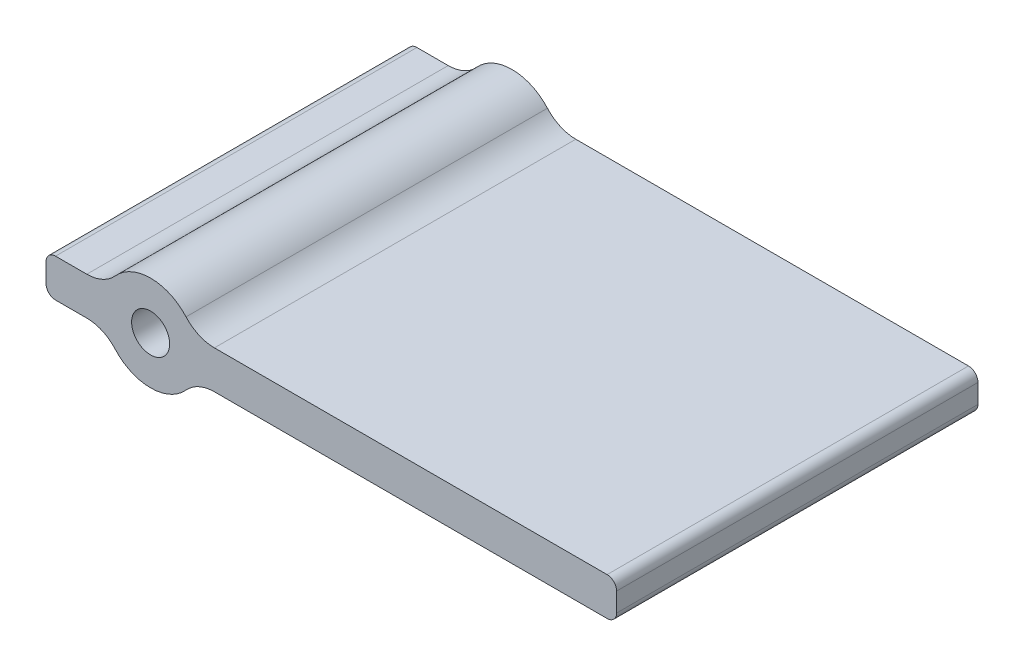
ISO-10303-21;
HEADER;
FILE_DESCRIPTION(('STEP AP214'),'2;1');
FILE_NAME('part.step','',(''),(''),'','','');
FILE_SCHEMA(('AUTOMOTIVE_DESIGN { 1 0 10303 214 1 1 1 1 }'));
ENDSEC;
DATA;
#1=APPLICATION_CONTEXT('core data for automotive mechanical design processes');
#2=APPLICATION_PROTOCOL_DEFINITION('international standard','automotive_design',2000,#1);
#3=PRODUCT_CONTEXT('',#1,'mechanical');
#4=PRODUCT('Part','Part','',(#3));
#5=PRODUCT_RELATED_PRODUCT_CATEGORY('part','',(#4));
#6=PRODUCT_DEFINITION_FORMATION('','',#4);
#7=PRODUCT_DEFINITION_CONTEXT('part definition',#1,'design');
#8=PRODUCT_DEFINITION('design','',#6,#7);
#9=PRODUCT_DEFINITION_SHAPE('','',#8);
#10=(LENGTH_UNIT() NAMED_UNIT(*) SI_UNIT(.MILLI.,.METRE.));
#11=(NAMED_UNIT(*) PLANE_ANGLE_UNIT() SI_UNIT($,.RADIAN.));
#12=(NAMED_UNIT(*) SI_UNIT($,.STERADIAN.) SOLID_ANGLE_UNIT());
#13=UNCERTAINTY_MEASURE_WITH_UNIT(LENGTH_MEASURE(1.E-05),#10,'distance_accuracy_value','');
#14=(GEOMETRIC_REPRESENTATION_CONTEXT(3) GLOBAL_UNCERTAINTY_ASSIGNED_CONTEXT((#13)) GLOBAL_UNIT_ASSIGNED_CONTEXT((#10,
#11,#12)) REPRESENTATION_CONTEXT('',''));
#15=CARTESIAN_POINT('',(0.,0.,0.));
#16=DIRECTION('',(0.,0.,1.));
#17=DIRECTION('',(1.,0.,0.));
#18=AXIS2_PLACEMENT_3D('',#15,#16,#17);
#19=CARTESIAN_POINT('',(-948.662974387242,303.887338025483,-9.5));
#20=DIRECTION('',(0.,0.,1.));
#21=DIRECTION('',(1.,0.,0.));
#22=AXIS2_PLACEMENT_3D('',#19,#20,#21);
#23=CYLINDRICAL_SURFACE('',#22,0.499999999999973);
#24=DIRECTION('',(0.,0.,1.));
#25=VECTOR('',#24,1.);
#26=CARTESIAN_POINT('',(-948.662974387242,303.387338025483,-9.5));
#27=LINE('',#26,#25);
#28=CARTESIAN_POINT('',(-948.662974387242,303.387338025483,-9.5));
#29=VERTEX_POINT('',#28);
#30=CARTESIAN_POINT('',(-948.662974387242,303.387338025483,9.5));
#31=VERTEX_POINT('',#30);
#32=EDGE_CURVE('E46',#29,#31,#27,.T.);
#33=ORIENTED_EDGE('',*,*,#32,.T.);
#34=CARTESIAN_POINT('',(-948.662974387242,303.887338025483,9.5));
#35=DIRECTION('',(0.,0.,1.));
#36=DIRECTION('',(-1.,0.,0.));
#37=AXIS2_PLACEMENT_3D('',#34,#35,#36);
#38=CIRCLE('',#37,0.499999999999973);
#39=CARTESIAN_POINT('',(-949.162974387242,303.887338025483,9.5));
#40=VERTEX_POINT('',#39);
#41=EDGE_CURVE('E155',#40,#31,#38,.T.);
#42=ORIENTED_EDGE('',*,*,#41,.F.);
#43=DIRECTION('',(0.,0.,1.));
#44=VECTOR('',#43,1.);
#45=CARTESIAN_POINT('',(-949.162974387242,303.887338025483,-9.5));
#46=LINE('',#45,#44);
#47=CARTESIAN_POINT('',(-949.162974387242,303.887338025483,-9.5));
#48=VERTEX_POINT('',#47);
#49=EDGE_CURVE('E13',#48,#40,#46,.T.);
#50=ORIENTED_EDGE('',*,*,#49,.F.);
#51=CARTESIAN_POINT('',(-948.662974387242,303.887338025483,-9.5));
#52=DIRECTION('',(0.,0.,1.));
#53=DIRECTION('',(-1.,0.,0.));
#54=AXIS2_PLACEMENT_3D('',#51,#52,#53);
#55=CIRCLE('',#54,0.499999999999973);
#56=EDGE_CURVE('E156',#48,#29,#55,.T.);
#57=ORIENTED_EDGE('',*,*,#56,.T.);
#58=EDGE_LOOP('',(#33,#42,#50,#57));
#59=FACE_BOUND('',#58,.T.);
#60=ADVANCED_FACE('F43',(#59),#23,.T.);
#61=CARTESIAN_POINT('',(-949.162974387242,303.887338025483,-9.5));
#62=DIRECTION('',(-1.,0.,0.));
#63=DIRECTION('',(0.,0.,1.));
#64=AXIS2_PLACEMENT_3D('',#61,#62,#63);
#65=PLANE('',#64);
#66=ORIENTED_EDGE('',*,*,#49,.T.);
#67=DIRECTION('',(0.,-1.,0.));
#68=VECTOR('',#67,1.);
#69=CARTESIAN_POINT('',(-949.162974387242,303.887338025483,9.5));
#70=LINE('',#69,#68);
#71=CARTESIAN_POINT('',(-949.162974387242,304.887338025483,9.5));
#72=VERTEX_POINT('',#71);
#73=EDGE_CURVE('E174',#72,#40,#70,.T.);
#74=ORIENTED_EDGE('',*,*,#73,.F.);
#75=DIRECTION('',(0.,0.,1.));
#76=VECTOR('',#75,1.);
#77=CARTESIAN_POINT('',(-949.162974387242,304.887338025483,-9.5));
#78=LINE('',#77,#76);
#79=CARTESIAN_POINT('',(-949.162974387242,304.887338025483,-9.5));
#80=VERTEX_POINT('',#79);
#81=EDGE_CURVE('E51',#80,#72,#78,.T.);
#82=ORIENTED_EDGE('',*,*,#81,.F.);
#83=DIRECTION('',(0.,-1.,0.));
#84=VECTOR('',#83,1.);
#85=CARTESIAN_POINT('',(-949.162974387242,303.887338025483,-9.5));
#86=LINE('',#85,#84);
#87=EDGE_CURVE('E161',#80,#48,#86,.T.);
#88=ORIENTED_EDGE('',*,*,#87,.T.);
#89=EDGE_LOOP('',(#66,#74,#82,#88));
#90=FACE_BOUND('',#89,.T.);
#91=ADVANCED_FACE('F340',(#90),#65,.T.);
#92=CARTESIAN_POINT('',(-948.662974387242,304.887338025483,-9.5));
#93=DIRECTION('',(0.,0.,1.));
#94=DIRECTION('',(1.,0.,0.));
#95=AXIS2_PLACEMENT_3D('',#92,#93,#94);
#96=CYLINDRICAL_SURFACE('',#95,0.499999999999973);
#97=ORIENTED_EDGE('',*,*,#81,.T.);
#98=CARTESIAN_POINT('',(-948.662974387242,304.887338025483,9.5));
#99=DIRECTION('',(0.,0.,1.));
#100=DIRECTION('',(-1.,0.,0.));
#101=AXIS2_PLACEMENT_3D('',#98,#99,#100);
#102=CIRCLE('',#101,0.499999999999973);
#103=CARTESIAN_POINT('',(-948.662974387242,305.387338025483,9.5));
#104=VERTEX_POINT('',#103);
#105=EDGE_CURVE('E214',#104,#72,#102,.T.);
#106=ORIENTED_EDGE('',*,*,#105,.F.);
#107=DIRECTION('',(0.,0.,1.));
#108=VECTOR('',#107,1.);
#109=CARTESIAN_POINT('',(-948.662974387242,305.387338025483,-9.5));
#110=LINE('',#109,#108);
#111=CARTESIAN_POINT('',(-948.662974387242,305.387338025483,-9.5));
#112=VERTEX_POINT('',#111);
#113=EDGE_CURVE('E263',#112,#104,#110,.T.);
#114=ORIENTED_EDGE('',*,*,#113,.F.);
#115=CARTESIAN_POINT('',(-948.662974387242,304.887338025483,-9.5));
#116=DIRECTION('',(0.,0.,1.));
#117=DIRECTION('',(-1.,0.,0.));
#118=AXIS2_PLACEMENT_3D('',#115,#116,#117);
#119=CIRCLE('',#118,0.499999999999973);
#120=EDGE_CURVE('E259',#112,#80,#119,.T.);
#121=ORIENTED_EDGE('',*,*,#120,.T.);
#122=EDGE_LOOP('',(#97,#106,#114,#121));
#123=FACE_BOUND('',#122,.T.);
#124=ADVANCED_FACE('F338',(#123),#96,.T.);
#125=CARTESIAN_POINT('',(-948.662974387242,305.387338025483,-9.5));
#126=DIRECTION('',(0.,1.,0.));
#127=DIRECTION('',(0.,0.,1.));
#128=AXIS2_PLACEMENT_3D('',#125,#126,#127);
#129=PLANE('',#128);
#130=ORIENTED_EDGE('',*,*,#113,.T.);
#131=DIRECTION('',(-1.,0.,0.));
#132=VECTOR('',#131,1.);
#133=CARTESIAN_POINT('',(-948.662974387242,305.387338025483,9.5));
#134=LINE('',#133,#132);
#135=CARTESIAN_POINT('',(-947.017076353491,305.387338025483,9.5));
#136=VERTEX_POINT('',#135);
#137=EDGE_CURVE('E211',#136,#104,#134,.T.);
#138=ORIENTED_EDGE('',*,*,#137,.F.);
#139=DIRECTION('',(0.,0.,1.));
#140=VECTOR('',#139,1.);
#141=CARTESIAN_POINT('',(-947.017076353491,305.387338025483,-9.5));
#142=LINE('',#141,#140);
#143=CARTESIAN_POINT('',(-947.017076353491,305.387338025483,-9.5));
#144=VERTEX_POINT('',#143);
#145=EDGE_CURVE('E265',#144,#136,#142,.T.);
#146=ORIENTED_EDGE('',*,*,#145,.F.);
#147=DIRECTION('',(-1.,0.,0.));
#148=VECTOR('',#147,1.);
#149=CARTESIAN_POINT('',(-948.662974387242,305.387338025483,-9.5));
#150=LINE('',#149,#148);
#151=EDGE_CURVE('E256',#144,#112,#150,.T.);
#152=ORIENTED_EDGE('',*,*,#151,.T.);
#153=EDGE_LOOP('',(#130,#138,#146,#152));
#154=FACE_BOUND('',#153,.T.);
#155=ADVANCED_FACE('F334',(#154),#129,.T.);
#156=CARTESIAN_POINT('',(-947.017076353491,307.387338025483,-9.5));
#157=DIRECTION('',(0.,0.,1.));
#158=DIRECTION('',(1.,0.,0.));
#159=AXIS2_PLACEMENT_3D('',#156,#157,#158);
#160=CYLINDRICAL_SURFACE('',#159,2.);
#161=ORIENTED_EDGE('',*,*,#145,.T.);
#162=CARTESIAN_POINT('',(-947.017076353491,307.387338025483,9.5));
#163=DIRECTION('',(0.,0.,-1.));
#164=DIRECTION('',(1.,0.,0.));
#165=AXIS2_PLACEMENT_3D('',#162,#163,#164);
#166=CIRCLE('',#165,2.);
#167=CARTESIAN_POINT('',(-945.526364368492,306.054004692149,9.5));
#168=VERTEX_POINT('',#167);
#169=EDGE_CURVE('E208',#168,#136,#166,.T.);
#170=ORIENTED_EDGE('',*,*,#169,.F.);
#171=DIRECTION('',(0.,0.,1.));
#172=VECTOR('',#171,1.);
#173=CARTESIAN_POINT('',(-945.526364368492,306.054004692149,-9.5));
#174=LINE('',#173,#172);
#175=CARTESIAN_POINT('',(-945.526364368492,306.054004692149,-9.5));
#176=VERTEX_POINT('',#175);
#177=EDGE_CURVE('E267',#176,#168,#174,.T.);
#178=ORIENTED_EDGE('',*,*,#177,.F.);
#179=CARTESIAN_POINT('',(-947.017076353491,307.387338025483,-9.5));
#180=DIRECTION('',(0.,0.,-1.));
#181=DIRECTION('',(1.,0.,0.));
#182=AXIS2_PLACEMENT_3D('',#179,#180,#181);
#183=CIRCLE('',#182,2.);
#184=EDGE_CURVE('E253',#176,#144,#183,.T.);
#185=ORIENTED_EDGE('',*,*,#184,.T.);
#186=EDGE_LOOP('',(#161,#170,#178,#185));
#187=FACE_BOUND('',#186,.T.);
#188=ADVANCED_FACE('F332',(#187),#160,.F.);
#189=CARTESIAN_POINT('',(-943.662974387242,304.387338025483,-9.5));
#190=DIRECTION('',(0.,0.,1.));
#191=DIRECTION('',(1.,0.,0.));
#192=AXIS2_PLACEMENT_3D('',#189,#190,#191);
#193=CYLINDRICAL_SURFACE('',#192,2.49999999999997);
#194=ORIENTED_EDGE('',*,*,#177,.T.);
#195=CARTESIAN_POINT('',(-943.662974387242,304.387338025483,9.5));
#196=DIRECTION('',(0.,0.,1.));
#197=DIRECTION('',(1.,0.,0.));
#198=AXIS2_PLACEMENT_3D('',#195,#196,#197);
#199=CIRCLE('',#198,2.49999999999997);
#200=CARTESIAN_POINT('',(-941.799584405992,306.054004692149,9.5));
#201=VERTEX_POINT('',#200);
#202=EDGE_CURVE('E205',#201,#168,#199,.T.);
#203=ORIENTED_EDGE('',*,*,#202,.F.);
#204=DIRECTION('',(0.,0.,1.));
#205=VECTOR('',#204,1.);
#206=CARTESIAN_POINT('',(-941.799584405992,306.054004692149,-9.5));
#207=LINE('',#206,#205);
#208=CARTESIAN_POINT('',(-941.799584405992,306.054004692149,-9.5));
#209=VERTEX_POINT('',#208);
#210=EDGE_CURVE('E269',#209,#201,#207,.T.);
#211=ORIENTED_EDGE('',*,*,#210,.F.);
#212=CARTESIAN_POINT('',(-943.662974387242,304.387338025483,-9.5));
#213=DIRECTION('',(0.,0.,1.));
#214=DIRECTION('',(1.,0.,0.));
#215=AXIS2_PLACEMENT_3D('',#212,#213,#214);
#216=CIRCLE('',#215,2.49999999999997);
#217=EDGE_CURVE('E250',#209,#176,#216,.T.);
#218=ORIENTED_EDGE('',*,*,#217,.T.);
#219=EDGE_LOOP('',(#194,#203,#211,#218));
#220=FACE_BOUND('',#219,.T.);
#221=ADVANCED_FACE('F327',(#220),#193,.T.);
#222=CARTESIAN_POINT('',(-940.308872420992,307.387338025483,-9.5));
#223=DIRECTION('',(0.,0.,1.));
#224=DIRECTION('',(1.,0.,0.));
#225=AXIS2_PLACEMENT_3D('',#222,#223,#224);
#226=CYLINDRICAL_SURFACE('',#225,2.);
#227=ORIENTED_EDGE('',*,*,#210,.T.);
#228=CARTESIAN_POINT('',(-940.308872420992,307.387338025483,9.5));
#229=DIRECTION('',(0.,0.,-1.));
#230=DIRECTION('',(1.,0.,0.));
#231=AXIS2_PLACEMENT_3D('',#228,#229,#230);
#232=CIRCLE('',#231,2.);
#233=CARTESIAN_POINT('',(-940.308872420992,305.387338025483,9.5));
#234=VERTEX_POINT('',#233);
#235=EDGE_CURVE('E202',#234,#201,#232,.T.);
#236=ORIENTED_EDGE('',*,*,#235,.F.);
#237=DIRECTION('',(0.,0.,1.));
#238=VECTOR('',#237,1.);
#239=CARTESIAN_POINT('',(-940.308872420992,305.387338025483,-9.5));
#240=LINE('',#239,#238);
#241=CARTESIAN_POINT('',(-940.308872420992,305.387338025483,-9.5));
#242=VERTEX_POINT('',#241);
#243=EDGE_CURVE('E271',#242,#234,#240,.T.);
#244=ORIENTED_EDGE('',*,*,#243,.F.);
#245=CARTESIAN_POINT('',(-940.308872420992,307.387338025483,-9.5));
#246=DIRECTION('',(0.,0.,-1.));
#247=DIRECTION('',(1.,0.,0.));
#248=AXIS2_PLACEMENT_3D('',#245,#246,#247);
#249=CIRCLE('',#248,2.);
#250=EDGE_CURVE('E247',#242,#209,#249,.T.);
#251=ORIENTED_EDGE('',*,*,#250,.T.);
#252=EDGE_LOOP('',(#227,#236,#244,#251));
#253=FACE_BOUND('',#252,.T.);
#254=ADVANCED_FACE('F322',(#253),#226,.F.);
#255=CARTESIAN_POINT('',(-940.308872420992,305.387338025483,-9.5));
#256=DIRECTION('',(0.,1.,0.));
#257=DIRECTION('',(0.,0.,1.));
#258=AXIS2_PLACEMENT_3D('',#255,#256,#257);
#259=PLANE('',#258);
#260=ORIENTED_EDGE('',*,*,#243,.T.);
#261=DIRECTION('',(-1.,0.,0.));
#262=VECTOR('',#261,1.);
#263=CARTESIAN_POINT('',(-940.308872420992,305.387338025483,9.5));
#264=LINE('',#263,#262);
#265=CARTESIAN_POINT('',(-919.662974387242,305.387338025483,9.5));
#266=VERTEX_POINT('',#265);
#267=EDGE_CURVE('E199',#266,#234,#264,.T.);
#268=ORIENTED_EDGE('',*,*,#267,.F.);
#269=DIRECTION('',(0.,0.,1.));
#270=VECTOR('',#269,1.);
#271=CARTESIAN_POINT('',(-919.662974387242,305.387338025483,-9.5));
#272=LINE('',#271,#270);
#273=CARTESIAN_POINT('',(-919.662974387242,305.387338025483,-9.5));
#274=VERTEX_POINT('',#273);
#275=EDGE_CURVE('E273',#274,#266,#272,.T.);
#276=ORIENTED_EDGE('',*,*,#275,.F.);
#277=DIRECTION('',(-1.,0.,0.));
#278=VECTOR('',#277,1.);
#279=CARTESIAN_POINT('',(-940.308872420992,305.387338025483,-9.5));
#280=LINE('',#279,#278);
#281=EDGE_CURVE('E244',#274,#242,#280,.T.);
#282=ORIENTED_EDGE('',*,*,#281,.T.);
#283=EDGE_LOOP('',(#260,#268,#276,#282));
#284=FACE_BOUND('',#283,.T.);
#285=ADVANCED_FACE('F320',(#284),#259,.T.);
#286=CARTESIAN_POINT('',(-919.662974387242,304.887338025483,-9.5));
#287=DIRECTION('',(0.,0.,1.));
#288=DIRECTION('',(1.,0.,0.));
#289=AXIS2_PLACEMENT_3D('',#286,#287,#288);
#290=CYLINDRICAL_SURFACE('',#289,0.499999999999973);
#291=ORIENTED_EDGE('',*,*,#275,.T.);
#292=CARTESIAN_POINT('',(-919.662974387242,304.887338025483,9.5));
#293=DIRECTION('',(0.,0.,1.));
#294=DIRECTION('',(-1.,0.,0.));
#295=AXIS2_PLACEMENT_3D('',#292,#293,#294);
#296=CIRCLE('',#295,0.499999999999973);
#297=CARTESIAN_POINT('',(-919.162974387242,304.887338025483,9.5));
#298=VERTEX_POINT('',#297);
#299=EDGE_CURVE('E196',#298,#266,#296,.T.);
#300=ORIENTED_EDGE('',*,*,#299,.F.);
#301=DIRECTION('',(0.,0.,1.));
#302=VECTOR('',#301,1.);
#303=CARTESIAN_POINT('',(-919.162974387242,304.887338025483,-9.5));
#304=LINE('',#303,#302);
#305=CARTESIAN_POINT('',(-919.162974387242,304.887338025483,-9.5));
#306=VERTEX_POINT('',#305);
#307=EDGE_CURVE('E275',#306,#298,#304,.T.);
#308=ORIENTED_EDGE('',*,*,#307,.F.);
#309=CARTESIAN_POINT('',(-919.662974387242,304.887338025483,-9.5));
#310=DIRECTION('',(0.,0.,1.));
#311=DIRECTION('',(-1.,0.,0.));
#312=AXIS2_PLACEMENT_3D('',#309,#310,#311);
#313=CIRCLE('',#312,0.499999999999973);
#314=EDGE_CURVE('E241',#306,#274,#313,.T.);
#315=ORIENTED_EDGE('',*,*,#314,.T.);
#316=EDGE_LOOP('',(#291,#300,#308,#315));
#317=FACE_BOUND('',#316,.T.);
#318=ADVANCED_FACE('F315',(#317),#290,.T.);
#319=CARTESIAN_POINT('',(-919.162974387242,303.887338025483,-9.5));
#320=DIRECTION('',(1.,0.,0.));
#321=DIRECTION('',(0.,0.,-1.));
#322=AXIS2_PLACEMENT_3D('',#319,#320,#321);
#323=PLANE('',#322);
#324=ORIENTED_EDGE('',*,*,#307,.T.);
#325=DIRECTION('',(0.,1.,0.));
#326=VECTOR('',#325,1.);
#327=CARTESIAN_POINT('',(-919.162974387242,303.887338025483,9.5));
#328=LINE('',#327,#326);
#329=CARTESIAN_POINT('',(-919.162974387242,303.887338025483,9.5));
#330=VERTEX_POINT('',#329);
#331=EDGE_CURVE('E193',#330,#298,#328,.T.);
#332=ORIENTED_EDGE('',*,*,#331,.F.);
#333=DIRECTION('',(0.,0.,1.));
#334=VECTOR('',#333,1.);
#335=CARTESIAN_POINT('',(-919.162974387242,303.887338025483,-9.5));
#336=LINE('',#335,#334);
#337=CARTESIAN_POINT('',(-919.162974387242,303.887338025483,-9.5));
#338=VERTEX_POINT('',#337);
#339=EDGE_CURVE('E277',#338,#330,#336,.T.);
#340=ORIENTED_EDGE('',*,*,#339,.F.);
#341=DIRECTION('',(0.,1.,0.));
#342=VECTOR('',#341,1.);
#343=CARTESIAN_POINT('',(-919.162974387242,303.887338025483,-9.5));
#344=LINE('',#343,#342);
#345=EDGE_CURVE('E238',#338,#306,#344,.T.);
#346=ORIENTED_EDGE('',*,*,#345,.T.);
#347=EDGE_LOOP('',(#324,#332,#340,#346));
#348=FACE_BOUND('',#347,.T.);
#349=ADVANCED_FACE('F310',(#348),#323,.T.);
#350=CARTESIAN_POINT('',(-919.662974387242,303.887338025483,-9.5));
#351=DIRECTION('',(0.,0.,1.));
#352=DIRECTION('',(1.,0.,0.));
#353=AXIS2_PLACEMENT_3D('',#350,#351,#352);
#354=CYLINDRICAL_SURFACE('',#353,0.499999999999973);
#355=ORIENTED_EDGE('',*,*,#339,.T.);
#356=CARTESIAN_POINT('',(-919.662974387242,303.887338025483,9.5));
#357=DIRECTION('',(0.,0.,1.));
#358=DIRECTION('',(1.,0.,0.));
#359=AXIS2_PLACEMENT_3D('',#356,#357,#358);
#360=CIRCLE('',#359,0.499999999999973);
#361=CARTESIAN_POINT('',(-919.662974387242,303.387338025483,9.5));
#362=VERTEX_POINT('',#361);
#363=EDGE_CURVE('E190',#362,#330,#360,.T.);
#364=ORIENTED_EDGE('',*,*,#363,.F.);
#365=DIRECTION('',(0.,0.,1.));
#366=VECTOR('',#365,1.);
#367=CARTESIAN_POINT('',(-919.662974387242,303.387338025483,-9.5));
#368=LINE('',#367,#366);
#369=CARTESIAN_POINT('',(-919.662974387242,303.387338025483,-9.5));
#370=VERTEX_POINT('',#369);
#371=EDGE_CURVE('E279',#370,#362,#368,.T.);
#372=ORIENTED_EDGE('',*,*,#371,.F.);
#373=CARTESIAN_POINT('',(-919.662974387242,303.887338025483,-9.5));
#374=DIRECTION('',(0.,0.,1.));
#375=DIRECTION('',(1.,0.,0.));
#376=AXIS2_PLACEMENT_3D('',#373,#374,#375);
#377=CIRCLE('',#376,0.499999999999973);
#378=EDGE_CURVE('E235',#370,#338,#377,.T.);
#379=ORIENTED_EDGE('',*,*,#378,.T.);
#380=EDGE_LOOP('',(#355,#364,#372,#379));
#381=FACE_BOUND('',#380,.T.);
#382=ADVANCED_FACE('F308',(#381),#354,.T.);
#383=CARTESIAN_POINT('',(-940.308872420992,303.387338025483,-9.5));
#384=DIRECTION('',(0.,-1.,0.));
#385=DIRECTION('',(0.,0.,-1.));
#386=AXIS2_PLACEMENT_3D('',#383,#384,#385);
#387=PLANE('',#386);
#388=ORIENTED_EDGE('',*,*,#371,.T.);
#389=DIRECTION('',(1.,0.,0.));
#390=VECTOR('',#389,1.);
#391=CARTESIAN_POINT('',(-940.308872420992,303.387338025483,9.5));
#392=LINE('',#391,#390);
#393=CARTESIAN_POINT('',(-940.308872420992,303.387338025483,9.5));
#394=VERTEX_POINT('',#393);
#395=EDGE_CURVE('E187',#394,#362,#392,.T.);
#396=ORIENTED_EDGE('',*,*,#395,.F.);
#397=DIRECTION('',(0.,0.,1.));
#398=VECTOR('',#397,1.);
#399=CARTESIAN_POINT('',(-940.308872420992,303.387338025483,-9.5));
#400=LINE('',#399,#398);
#401=CARTESIAN_POINT('',(-940.308872420992,303.387338025483,-9.5));
#402=VERTEX_POINT('',#401);
#403=EDGE_CURVE('E281',#402,#394,#400,.T.);
#404=ORIENTED_EDGE('',*,*,#403,.F.);
#405=DIRECTION('',(1.,0.,0.));
#406=VECTOR('',#405,1.);
#407=CARTESIAN_POINT('',(-940.308872420992,303.387338025483,-9.5));
#408=LINE('',#407,#406);
#409=EDGE_CURVE('E232',#402,#370,#408,.T.);
#410=ORIENTED_EDGE('',*,*,#409,.T.);
#411=EDGE_LOOP('',(#388,#396,#404,#410));
#412=FACE_BOUND('',#411,.T.);
#413=ADVANCED_FACE('F303',(#412),#387,.T.);
#414=CARTESIAN_POINT('',(-940.308872420992,301.387338025483,-9.5));
#415=DIRECTION('',(0.,0.,1.));
#416=DIRECTION('',(1.,0.,0.));
#417=AXIS2_PLACEMENT_3D('',#414,#415,#416);
#418=CYLINDRICAL_SURFACE('',#417,2.);
#419=ORIENTED_EDGE('',*,*,#403,.T.);
#420=CARTESIAN_POINT('',(-940.308872420992,301.387338025483,9.5));
#421=DIRECTION('',(0.,0.,-1.));
#422=DIRECTION('',(-1.,0.,0.));
#423=AXIS2_PLACEMENT_3D('',#420,#421,#422);
#424=CIRCLE('',#423,2.);
#425=CARTESIAN_POINT('',(-941.799584405992,302.720671358816,9.5));
#426=VERTEX_POINT('',#425);
#427=EDGE_CURVE('E184',#426,#394,#424,.T.);
#428=ORIENTED_EDGE('',*,*,#427,.F.);
#429=DIRECTION('',(0.,0.,1.));
#430=VECTOR('',#429,1.);
#431=CARTESIAN_POINT('',(-941.799584405992,302.720671358816,-9.5));
#432=LINE('',#431,#430);
#433=CARTESIAN_POINT('',(-941.799584405992,302.720671358816,-9.5));
#434=VERTEX_POINT('',#433);
#435=EDGE_CURVE('E283',#434,#426,#432,.T.);
#436=ORIENTED_EDGE('',*,*,#435,.F.);
#437=CARTESIAN_POINT('',(-940.308872420992,301.387338025483,-9.5));
#438=DIRECTION('',(0.,0.,-1.));
#439=DIRECTION('',(-1.,0.,0.));
#440=AXIS2_PLACEMENT_3D('',#437,#438,#439);
#441=CIRCLE('',#440,2.);
#442=EDGE_CURVE('E229',#434,#402,#441,.T.);
#443=ORIENTED_EDGE('',*,*,#442,.T.);
#444=EDGE_LOOP('',(#419,#428,#436,#443));
#445=FACE_BOUND('',#444,.T.);
#446=ADVANCED_FACE('F296',(#445),#418,.F.);
#447=CARTESIAN_POINT('',(-943.662974387242,304.387338025483,-9.5));
#448=DIRECTION('',(0.,0.,1.));
#449=DIRECTION('',(1.,0.,0.));
#450=AXIS2_PLACEMENT_3D('',#447,#448,#449);
#451=CYLINDRICAL_SURFACE('',#450,2.49999999999997);
#452=ORIENTED_EDGE('',*,*,#435,.T.);
#453=CARTESIAN_POINT('',(-943.662974387242,304.387338025483,9.5));
#454=DIRECTION('',(0.,0.,1.));
#455=DIRECTION('',(1.,0.,0.));
#456=AXIS2_PLACEMENT_3D('',#453,#454,#455);
#457=CIRCLE('',#456,2.49999999999997);
#458=CARTESIAN_POINT('',(-945.526364368492,302.720671358816,9.5));
#459=VERTEX_POINT('',#458);
#460=EDGE_CURVE('E181',#459,#426,#457,.T.);
#461=ORIENTED_EDGE('',*,*,#460,.F.);
#462=DIRECTION('',(0.,0.,1.));
#463=VECTOR('',#462,1.);
#464=CARTESIAN_POINT('',(-945.526364368492,302.720671358816,-9.5));
#465=LINE('',#464,#463);
#466=CARTESIAN_POINT('',(-945.526364368492,302.720671358816,-9.5));
#467=VERTEX_POINT('',#466);
#468=EDGE_CURVE('E285',#467,#459,#465,.T.);
#469=ORIENTED_EDGE('',*,*,#468,.F.);
#470=CARTESIAN_POINT('',(-943.662974387242,304.387338025483,-9.5));
#471=DIRECTION('',(0.,0.,1.));
#472=DIRECTION('',(1.,0.,0.));
#473=AXIS2_PLACEMENT_3D('',#470,#471,#472);
#474=CIRCLE('',#473,2.49999999999997);
#475=EDGE_CURVE('E226',#467,#434,#474,.T.);
#476=ORIENTED_EDGE('',*,*,#475,.T.);
#477=EDGE_LOOP('',(#452,#461,#469,#476));
#478=FACE_BOUND('',#477,.T.);
#479=ADVANCED_FACE('F293',(#478),#451,.T.);
#480=CARTESIAN_POINT('',(-947.017076353491,301.387338025483,-9.5));
#481=DIRECTION('',(0.,0.,1.));
#482=DIRECTION('',(1.,0.,0.));
#483=AXIS2_PLACEMENT_3D('',#480,#481,#482);
#484=CYLINDRICAL_SURFACE('',#483,2.);
#485=ORIENTED_EDGE('',*,*,#468,.T.);
#486=CARTESIAN_POINT('',(-947.017076353491,301.387338025483,9.5));
#487=DIRECTION('',(0.,0.,-1.));
#488=DIRECTION('',(1.,0.,0.));
#489=AXIS2_PLACEMENT_3D('',#486,#487,#488);
#490=CIRCLE('',#489,2.);
#491=CARTESIAN_POINT('',(-947.017076353491,303.387338025483,9.5));
#492=VERTEX_POINT('',#491);
#493=EDGE_CURVE('E168',#492,#459,#490,.T.);
#494=ORIENTED_EDGE('',*,*,#493,.F.);
#495=DIRECTION('',(0.,0.,1.));
#496=VECTOR('',#495,1.);
#497=CARTESIAN_POINT('',(-947.017076353491,303.387338025483,-9.5));
#498=LINE('',#497,#496);
#499=CARTESIAN_POINT('',(-947.017076353491,303.387338025483,-9.5));
#500=VERTEX_POINT('',#499);
#501=EDGE_CURVE('E160',#500,#492,#498,.T.);
#502=ORIENTED_EDGE('',*,*,#501,.F.);
#503=CARTESIAN_POINT('',(-947.017076353491,301.387338025483,-9.5));
#504=DIRECTION('',(0.,0.,-1.));
#505=DIRECTION('',(1.,0.,0.));
#506=AXIS2_PLACEMENT_3D('',#503,#504,#505);
#507=CIRCLE('',#506,2.);
#508=EDGE_CURVE('E223',#500,#467,#507,.T.);
#509=ORIENTED_EDGE('',*,*,#508,.T.);
#510=EDGE_LOOP('',(#485,#494,#502,#509));
#511=FACE_BOUND('',#510,.T.);
#512=ADVANCED_FACE('F287',(#511),#484,.F.);
#513=CARTESIAN_POINT('',(-948.662974387242,303.387338025483,-9.5));
#514=DIRECTION('',(0.,-1.,0.));
#515=DIRECTION('',(0.,0.,-1.));
#516=AXIS2_PLACEMENT_3D('',#513,#514,#515);
#517=PLANE('',#516);
#518=ORIENTED_EDGE('',*,*,#501,.T.);
#519=DIRECTION('',(1.,0.,0.));
#520=VECTOR('',#519,1.);
#521=CARTESIAN_POINT('',(-948.662974387242,303.387338025483,9.5));
#522=LINE('',#521,#520);
#523=EDGE_CURVE('E163',#31,#492,#522,.T.);
#524=ORIENTED_EDGE('',*,*,#523,.F.);
#525=ORIENTED_EDGE('',*,*,#32,.F.);
#526=DIRECTION('',(1.,0.,0.));
#527=VECTOR('',#526,1.);
#528=CARTESIAN_POINT('',(-948.662974387242,303.387338025483,-9.5));
#529=LINE('',#528,#527);
#530=EDGE_CURVE('E221',#29,#500,#529,.T.);
#531=ORIENTED_EDGE('',*,*,#530,.T.);
#532=EDGE_LOOP('',(#518,#524,#525,#531));
#533=FACE_BOUND('',#532,.T.);
#534=ADVANCED_FACE('F164',(#533),#517,.T.);
#535=CARTESIAN_POINT('',(-948.662974387242,303.887338025483,-9.5));
#536=DIRECTION('',(0.,0.,-1.));
#537=DIRECTION('',(-1.,0.,0.));
#538=AXIS2_PLACEMENT_3D('',#535,#536,#537);
#539=PLANE('',#538);
#540=CARTESIAN_POINT('',(-943.662974387242,304.387338025483,-9.5));
#541=DIRECTION('',(0.,0.,1.));
#542=DIRECTION('',(1.,0.,0.));
#543=AXIS2_PLACEMENT_3D('',#540,#541,#542);
#544=CIRCLE('',#543,1.00000000000005);
#545=CARTESIAN_POINT('',(-942.662974387242,304.387338025483,-9.5));
#546=VERTEX_POINT('',#545);
#547=EDGE_CURVE('E217',#546,#546,#544,.T.);
#548=ORIENTED_EDGE('',*,*,#547,.T.);
#549=EDGE_LOOP('',(#548));
#550=FACE_BOUND('',#549,.T.);
#551=ORIENTED_EDGE('',*,*,#56,.F.);
#552=ORIENTED_EDGE('',*,*,#87,.F.);
#553=ORIENTED_EDGE('',*,*,#120,.F.);
#554=ORIENTED_EDGE('',*,*,#151,.F.);
#555=ORIENTED_EDGE('',*,*,#184,.F.);
#556=ORIENTED_EDGE('',*,*,#217,.F.);
#557=ORIENTED_EDGE('',*,*,#250,.F.);
#558=ORIENTED_EDGE('',*,*,#281,.F.);
#559=ORIENTED_EDGE('',*,*,#314,.F.);
#560=ORIENTED_EDGE('',*,*,#345,.F.);
#561=ORIENTED_EDGE('',*,*,#378,.F.);
#562=ORIENTED_EDGE('',*,*,#409,.F.);
#563=ORIENTED_EDGE('',*,*,#442,.F.);
#564=ORIENTED_EDGE('',*,*,#475,.F.);
#565=ORIENTED_EDGE('',*,*,#508,.F.);
#566=ORIENTED_EDGE('',*,*,#530,.F.);
#567=EDGE_LOOP('',(#551,#552,#553,#554,#555,#556,#557,#558,#559,#560,#561,#562,#563,#564,#565,#566));
#568=FACE_BOUND('',#567,.T.);
#569=ADVANCED_FACE('F299',(#550,#568),#539,.T.);
#570=CARTESIAN_POINT('',(-943.662974387242,304.387338025483,-9.5));
#571=DIRECTION('',(0.,0.,1.));
#572=DIRECTION('',(1.,0.,0.));
#573=AXIS2_PLACEMENT_3D('',#570,#571,#572);
#574=CYLINDRICAL_SURFACE('',#573,1.00000000000005);
#575=ORIENTED_EDGE('',*,*,#547,.F.);
#576=EDGE_LOOP('',(#575));
#577=FACE_BOUND('',#576,.T.);
#578=CARTESIAN_POINT('',(-943.662974387242,304.387338025483,9.5));
#579=DIRECTION('',(0.,0.,1.));
#580=DIRECTION('',(1.,0.,0.));
#581=AXIS2_PLACEMENT_3D('',#578,#579,#580);
#582=CIRCLE('',#581,1.00000000000005);
#583=CARTESIAN_POINT('',(-942.662974387242,304.387338025483,9.5));
#584=VERTEX_POINT('',#583);
#585=EDGE_CURVE('E175',#584,#584,#582,.T.);
#586=ORIENTED_EDGE('',*,*,#585,.T.);
#587=EDGE_LOOP('',(#586));
#588=FACE_BOUND('',#587,.T.);
#589=ADVANCED_FACE('F378',(#577,#588),#574,.F.);
#590=CARTESIAN_POINT('',(-948.662974387242,303.887338025483,9.5));
#591=DIRECTION('',(0.,0.,-1.));
#592=DIRECTION('',(-1.,0.,0.));
#593=AXIS2_PLACEMENT_3D('',#590,#591,#592);
#594=PLANE('',#593);
#595=ORIENTED_EDGE('',*,*,#41,.T.);
#596=ORIENTED_EDGE('',*,*,#523,.T.);
#597=ORIENTED_EDGE('',*,*,#493,.T.);
#598=ORIENTED_EDGE('',*,*,#460,.T.);
#599=ORIENTED_EDGE('',*,*,#427,.T.);
#600=ORIENTED_EDGE('',*,*,#395,.T.);
#601=ORIENTED_EDGE('',*,*,#363,.T.);
#602=ORIENTED_EDGE('',*,*,#331,.T.);
#603=ORIENTED_EDGE('',*,*,#299,.T.);
#604=ORIENTED_EDGE('',*,*,#267,.T.);
#605=ORIENTED_EDGE('',*,*,#235,.T.);
#606=ORIENTED_EDGE('',*,*,#202,.T.);
#607=ORIENTED_EDGE('',*,*,#169,.T.);
#608=ORIENTED_EDGE('',*,*,#137,.T.);
#609=ORIENTED_EDGE('',*,*,#105,.T.);
#610=ORIENTED_EDGE('',*,*,#73,.T.);
#611=EDGE_LOOP('',(#595,#596,#597,#598,#599,#600,#601,#602,#603,#604,#605,#606,#607,#608,#609,#610));
#612=FACE_BOUND('',#611,.T.);
#613=ORIENTED_EDGE('',*,*,#585,.F.);
#614=EDGE_LOOP('',(#613));
#615=FACE_BOUND('',#614,.T.);
#616=ADVANCED_FACE('F171',(#612,#615),#594,.F.);
#617=CLOSED_SHELL('',(#60,#91,#124,#155,#188,#221,#254,#285,#318,#349,#382,#413,#446,#479,#512,
#534,#569,#589,#616));
#618=MANIFOLD_SOLID_BREP('B2',#617);
#619=ADVANCED_BREP_SHAPE_REPRESENTATION('',(#18,#618),#14);
#620=SHAPE_DEFINITION_REPRESENTATION(#9,#619);
ENDSEC;
END-ISO-10303-21;
